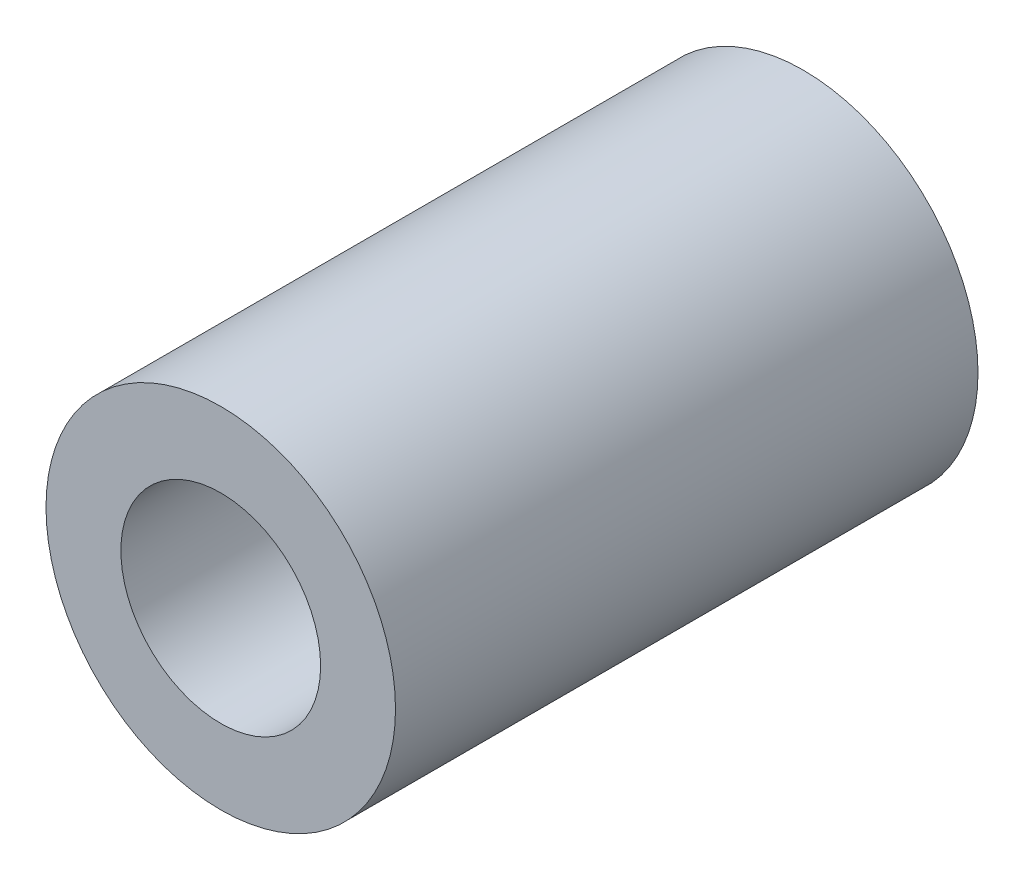
ISO-10303-21;
HEADER;
FILE_DESCRIPTION(('STEP AP214'),'2;1');
FILE_NAME('part.step','',(''),(''),'','','');
FILE_SCHEMA(('AUTOMOTIVE_DESIGN { 1 0 10303 214 1 1 1 1 }'));
ENDSEC;
DATA;
#1=APPLICATION_CONTEXT('core data for automotive mechanical design processes');
#2=APPLICATION_PROTOCOL_DEFINITION('international standard','automotive_design',2000,#1);
#3=PRODUCT_CONTEXT('',#1,'mechanical');
#4=PRODUCT('Part','Part','',(#3));
#5=PRODUCT_RELATED_PRODUCT_CATEGORY('part','',(#4));
#6=PRODUCT_DEFINITION_FORMATION('','',#4);
#7=PRODUCT_DEFINITION_CONTEXT('part definition',#1,'design');
#8=PRODUCT_DEFINITION('design','',#6,#7);
#9=PRODUCT_DEFINITION_SHAPE('','',#8);
#10=(LENGTH_UNIT() NAMED_UNIT(*) SI_UNIT(.MILLI.,.METRE.));
#11=(NAMED_UNIT(*) PLANE_ANGLE_UNIT() SI_UNIT($,.RADIAN.));
#12=(NAMED_UNIT(*) SI_UNIT($,.STERADIAN.) SOLID_ANGLE_UNIT());
#13=UNCERTAINTY_MEASURE_WITH_UNIT(LENGTH_MEASURE(1.E-05),#10,'distance_accuracy_value','');
#14=(GEOMETRIC_REPRESENTATION_CONTEXT(3) GLOBAL_UNCERTAINTY_ASSIGNED_CONTEXT((#13)) GLOBAL_UNIT_ASSIGNED_CONTEXT((#10,
#11,#12)) REPRESENTATION_CONTEXT('',''));
#15=CARTESIAN_POINT('',(0.,0.,0.));
#16=DIRECTION('',(0.,0.,1.));
#17=DIRECTION('',(1.,0.,0.));
#18=AXIS2_PLACEMENT_3D('',#15,#16,#17);
#19=CARTESIAN_POINT('',(0.,0.,10.));
#20=DIRECTION('',(0.,0.,1.));
#21=DIRECTION('',(1.,0.,0.));
#22=AXIS2_PLACEMENT_3D('',#19,#20,#21);
#23=PLANE('',#22);
#24=CARTESIAN_POINT('',(0.,0.,10.));
#25=DIRECTION('',(0.,0.,1.));
#26=DIRECTION('',(1.,0.,0.));
#27=AXIS2_PLACEMENT_3D('',#24,#25,#26);
#28=CIRCLE('',#27,6.);
#29=CARTESIAN_POINT('',(6.,0.,10.));
#30=VERTEX_POINT('',#29);
#31=EDGE_CURVE('E10',#30,#30,#28,.T.);
#32=ORIENTED_EDGE('',*,*,#31,.T.);
#33=EDGE_LOOP('',(#32));
#34=FACE_BOUND('',#33,.T.);
#35=CARTESIAN_POINT('',(0.,0.,10.));
#36=DIRECTION('',(0.,0.,1.));
#37=DIRECTION('',(1.,0.,0.));
#38=AXIS2_PLACEMENT_3D('',#35,#36,#37);
#39=CIRCLE('',#38,3.429);
#40=CARTESIAN_POINT('',(3.429,0.,10.));
#41=VERTEX_POINT('',#40);
#42=EDGE_CURVE('E47',#41,#41,#39,.T.);
#43=ORIENTED_EDGE('',*,*,#42,.F.);
#44=EDGE_LOOP('',(#43));
#45=FACE_BOUND('',#44,.T.);
#46=ADVANCED_FACE('F33',(#34,#45),#23,.T.);
#47=CARTESIAN_POINT('',(0.,0.,-10.));
#48=DIRECTION('',(0.,0.,1.));
#49=DIRECTION('',(1.,0.,0.));
#50=AXIS2_PLACEMENT_3D('',#47,#48,#49);
#51=PLANE('',#50);
#52=CARTESIAN_POINT('',(0.,0.,-10.));
#53=DIRECTION('',(0.,0.,1.));
#54=DIRECTION('',(1.,0.,0.));
#55=AXIS2_PLACEMENT_3D('',#52,#53,#54);
#56=CIRCLE('',#55,6.);
#57=CARTESIAN_POINT('',(6.,0.,-10.));
#58=VERTEX_POINT('',#57);
#59=EDGE_CURVE('E37',#58,#58,#56,.T.);
#60=ORIENTED_EDGE('',*,*,#59,.F.);
#61=EDGE_LOOP('',(#60));
#62=FACE_BOUND('',#61,.T.);
#63=CARTESIAN_POINT('',(0.,0.,-10.));
#64=DIRECTION('',(0.,0.,1.));
#65=DIRECTION('',(1.,0.,0.));
#66=AXIS2_PLACEMENT_3D('',#63,#64,#65);
#67=CIRCLE('',#66,3.429);
#68=CARTESIAN_POINT('',(3.429,0.,-10.));
#69=VERTEX_POINT('',#68);
#70=EDGE_CURVE('E49',#69,#69,#67,.T.);
#71=ORIENTED_EDGE('',*,*,#70,.T.);
#72=EDGE_LOOP('',(#71));
#73=FACE_BOUND('',#72,.T.);
#74=ADVANCED_FACE('F60',(#62,#73),#51,.F.);
#75=CARTESIAN_POINT('',(0.,0.,10.));
#76=DIRECTION('',(0.,0.,-1.));
#77=DIRECTION('',(-1.,0.,0.));
#78=AXIS2_PLACEMENT_3D('',#75,#76,#77);
#79=CYLINDRICAL_SURFACE('',#78,6.);
#80=ORIENTED_EDGE('',*,*,#31,.F.);
#81=EDGE_LOOP('',(#80));
#82=FACE_BOUND('',#81,.T.);
#83=ORIENTED_EDGE('',*,*,#59,.T.);
#84=EDGE_LOOP('',(#83));
#85=FACE_BOUND('',#84,.T.);
#86=ADVANCED_FACE('F35',(#82,#85),#79,.T.);
#87=CARTESIAN_POINT('',(0.,0.,10.));
#88=DIRECTION('',(0.,0.,-1.));
#89=DIRECTION('',(-1.,0.,0.));
#90=AXIS2_PLACEMENT_3D('',#87,#88,#89);
#91=CYLINDRICAL_SURFACE('',#90,3.429);
#92=ORIENTED_EDGE('',*,*,#42,.T.);
#93=EDGE_LOOP('',(#92));
#94=FACE_BOUND('',#93,.T.);
#95=ORIENTED_EDGE('',*,*,#70,.F.);
#96=EDGE_LOOP('',(#95));
#97=FACE_BOUND('',#96,.T.);
#98=ADVANCED_FACE('F56',(#94,#97),#91,.F.);
#99=CLOSED_SHELL('',(#46,#74,#86,#98));
#100=MANIFOLD_SOLID_BREP('B2',#99);
#101=ADVANCED_BREP_SHAPE_REPRESENTATION('',(#18,#100),#14);
#102=SHAPE_DEFINITION_REPRESENTATION(#9,#101);
ENDSEC;
END-ISO-10303-21;
